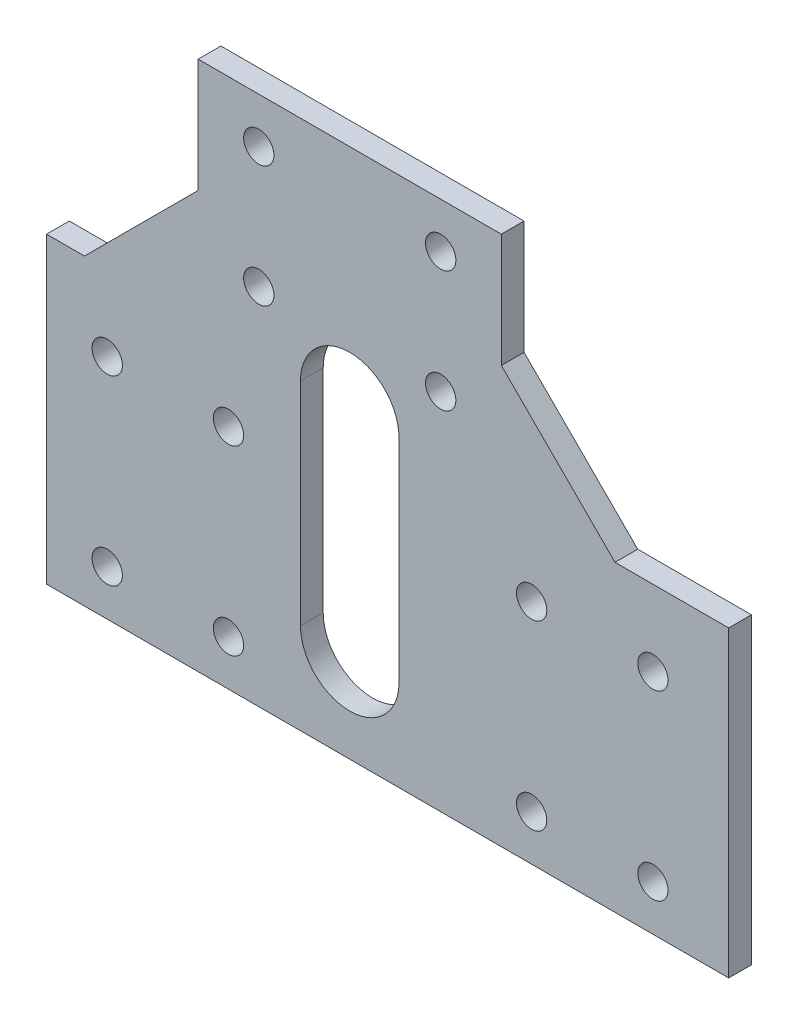
ISO-10303-21;
HEADER;
FILE_DESCRIPTION(('STEP AP214'),'2;1');
FILE_NAME('part.step','',(''),(''),'','','');
FILE_SCHEMA(('AUTOMOTIVE_DESIGN { 1 0 10303 214 1 1 1 1 }'));
ENDSEC;
DATA;
#1=APPLICATION_CONTEXT('core data for automotive mechanical design processes');
#2=APPLICATION_PROTOCOL_DEFINITION('international standard','automotive_design',2000,#1);
#3=PRODUCT_CONTEXT('',#1,'mechanical');
#4=PRODUCT('Part','Part','',(#3));
#5=PRODUCT_RELATED_PRODUCT_CATEGORY('part','',(#4));
#6=PRODUCT_DEFINITION_FORMATION('','',#4);
#7=PRODUCT_DEFINITION_CONTEXT('part definition',#1,'design');
#8=PRODUCT_DEFINITION('design','',#6,#7);
#9=PRODUCT_DEFINITION_SHAPE('','',#8);
#10=(LENGTH_UNIT() NAMED_UNIT(*) SI_UNIT(.MILLI.,.METRE.));
#11=(NAMED_UNIT(*) PLANE_ANGLE_UNIT() SI_UNIT($,.RADIAN.));
#12=(NAMED_UNIT(*) SI_UNIT($,.STERADIAN.) SOLID_ANGLE_UNIT());
#13=UNCERTAINTY_MEASURE_WITH_UNIT(LENGTH_MEASURE(1.E-05),#10,'distance_accuracy_value','');
#14=(GEOMETRIC_REPRESENTATION_CONTEXT(3) GLOBAL_UNCERTAINTY_ASSIGNED_CONTEXT((#13)) GLOBAL_UNIT_ASSIGNED_CONTEXT((#10,
#11,#12)) REPRESENTATION_CONTEXT('',''));
#15=CARTESIAN_POINT('',(0.,0.,0.));
#16=DIRECTION('',(0.,0.,1.));
#17=DIRECTION('',(1.,0.,0.));
#18=AXIS2_PLACEMENT_3D('',#15,#16,#17);
#19=CARTESIAN_POINT('',(0.,40.,3.));
#20=DIRECTION('',(0.,1.,0.));
#21=DIRECTION('',(0.,0.,1.));
#22=AXIS2_PLACEMENT_3D('',#19,#20,#21);
#23=PLANE('',#22);
#24=DIRECTION('',(1.,0.,0.));
#25=VECTOR('',#24,1.);
#26=CARTESIAN_POINT('',(0.,40.,0.));
#27=LINE('',#26,#25);
#28=CARTESIAN_POINT('',(74.9999999999998,40.,0.));
#29=VERTEX_POINT('',#28);
#30=CARTESIAN_POINT('',(90.,40.,0.));
#31=VERTEX_POINT('',#30);
#32=EDGE_CURVE('E238',#29,#31,#27,.T.);
#33=ORIENTED_EDGE('',*,*,#32,.F.);
#34=DIRECTION('',(0.,0.,-1.));
#35=VECTOR('',#34,1.);
#36=CARTESIAN_POINT('',(74.9999999999998,40.,3.));
#37=LINE('',#36,#35);
#38=CARTESIAN_POINT('',(74.9999999999998,40.,3.));
#39=VERTEX_POINT('',#38);
#40=EDGE_CURVE('E11',#39,#29,#37,.T.);
#41=ORIENTED_EDGE('',*,*,#40,.F.);
#42=DIRECTION('',(1.,0.,0.));
#43=VECTOR('',#42,1.);
#44=CARTESIAN_POINT('',(0.,40.,3.));
#45=LINE('',#44,#43);
#46=CARTESIAN_POINT('',(90.,40.,3.));
#47=VERTEX_POINT('',#46);
#48=EDGE_CURVE('E241',#39,#47,#45,.T.);
#49=ORIENTED_EDGE('',*,*,#48,.T.);
#50=DIRECTION('',(0.,0.,-1.));
#51=VECTOR('',#50,1.);
#52=CARTESIAN_POINT('',(90.,40.,3.));
#53=LINE('',#52,#51);
#54=EDGE_CURVE('E272',#47,#31,#53,.T.);
#55=ORIENTED_EDGE('',*,*,#54,.T.);
#56=EDGE_LOOP('',(#33,#41,#49,#55));
#57=FACE_BOUND('',#56,.T.);
#58=ADVANCED_FACE('F35',(#57),#23,.T.);
#59=CARTESIAN_POINT('',(57.5,57.4999999999998,3.));
#60=DIRECTION('',(0.707106781186549,0.707106781186546,0.));
#61=DIRECTION('',(-0.707106781186546,0.707106781186549,0.));
#62=AXIS2_PLACEMENT_3D('',#59,#60,#61);
#63=PLANE('',#62);
#64=DIRECTION('',(0.707106781186546,-0.707106781186549,0.));
#65=VECTOR('',#64,1.);
#66=CARTESIAN_POINT('',(57.5,57.4999999999998,0.));
#67=LINE('',#66,#65);
#68=CARTESIAN_POINT('',(60.,54.9999999999998,0.));
#69=VERTEX_POINT('',#68);
#70=EDGE_CURVE('E275',#69,#29,#67,.T.);
#71=ORIENTED_EDGE('',*,*,#70,.F.);
#72=DIRECTION('',(0.,0.,-1.));
#73=VECTOR('',#72,1.);
#74=CARTESIAN_POINT('',(60.,54.9999999999998,3.));
#75=LINE('',#74,#73);
#76=CARTESIAN_POINT('',(60.,54.9999999999998,3.));
#77=VERTEX_POINT('',#76);
#78=EDGE_CURVE('E42',#77,#69,#75,.T.);
#79=ORIENTED_EDGE('',*,*,#78,.F.);
#80=DIRECTION('',(0.707106781186546,-0.707106781186549,0.));
#81=VECTOR('',#80,1.);
#82=CARTESIAN_POINT('',(57.5,57.4999999999998,3.));
#83=LINE('',#82,#81);
#84=EDGE_CURVE('E244',#77,#39,#83,.T.);
#85=ORIENTED_EDGE('',*,*,#84,.T.);
#86=ORIENTED_EDGE('',*,*,#40,.T.);
#87=EDGE_LOOP('',(#71,#79,#85,#86));
#88=FACE_BOUND('',#87,.T.);
#89=ADVANCED_FACE('F322',(#88),#63,.T.);
#90=CARTESIAN_POINT('',(60.,0.,3.));
#91=DIRECTION('',(1.,0.,0.));
#92=DIRECTION('',(0.,1.,0.));
#93=AXIS2_PLACEMENT_3D('',#90,#91,#92);
#94=PLANE('',#93);
#95=DIRECTION('',(0.,-1.,0.));
#96=VECTOR('',#95,1.);
#97=CARTESIAN_POINT('',(60.,0.,0.));
#98=LINE('',#97,#96);
#99=CARTESIAN_POINT('',(60.,70.,0.));
#100=VERTEX_POINT('',#99);
#101=EDGE_CURVE('E278',#100,#69,#98,.T.);
#102=ORIENTED_EDGE('',*,*,#101,.F.);
#103=DIRECTION('',(0.,0.,-1.));
#104=VECTOR('',#103,1.);
#105=CARTESIAN_POINT('',(60.,70.,3.));
#106=LINE('',#105,#104);
#107=CARTESIAN_POINT('',(60.,70.,3.));
#108=VERTEX_POINT('',#107);
#109=EDGE_CURVE('E314',#108,#100,#106,.T.);
#110=ORIENTED_EDGE('',*,*,#109,.F.);
#111=DIRECTION('',(0.,-1.,0.));
#112=VECTOR('',#111,1.);
#113=CARTESIAN_POINT('',(60.,0.,3.));
#114=LINE('',#113,#112);
#115=EDGE_CURVE('E248',#108,#77,#114,.T.);
#116=ORIENTED_EDGE('',*,*,#115,.T.);
#117=ORIENTED_EDGE('',*,*,#78,.T.);
#118=EDGE_LOOP('',(#102,#110,#116,#117));
#119=FACE_BOUND('',#118,.T.);
#120=ADVANCED_FACE('F318',(#119),#94,.T.);
#121=CARTESIAN_POINT('',(0.,70.,3.));
#122=DIRECTION('',(0.,1.,0.));
#123=DIRECTION('',(-1.,0.,0.));
#124=AXIS2_PLACEMENT_3D('',#121,#122,#123);
#125=PLANE('',#124);
#126=DIRECTION('',(1.,0.,0.));
#127=VECTOR('',#126,1.);
#128=CARTESIAN_POINT('',(0.,70.,0.));
#129=LINE('',#128,#127);
#130=CARTESIAN_POINT('',(20.,70.,0.));
#131=VERTEX_POINT('',#130);
#132=EDGE_CURVE('E281',#131,#100,#129,.T.);
#133=ORIENTED_EDGE('',*,*,#132,.F.);
#134=DIRECTION('',(0.,0.,-1.));
#135=VECTOR('',#134,1.);
#136=CARTESIAN_POINT('',(20.,70.,3.));
#137=LINE('',#136,#135);
#138=CARTESIAN_POINT('',(20.,70.,3.));
#139=VERTEX_POINT('',#138);
#140=EDGE_CURVE('E312',#139,#131,#137,.T.);
#141=ORIENTED_EDGE('',*,*,#140,.F.);
#142=DIRECTION('',(1.,0.,0.));
#143=VECTOR('',#142,1.);
#144=CARTESIAN_POINT('',(0.,70.,3.));
#145=LINE('',#144,#143);
#146=EDGE_CURVE('E251',#139,#108,#145,.T.);
#147=ORIENTED_EDGE('',*,*,#146,.T.);
#148=ORIENTED_EDGE('',*,*,#109,.T.);
#149=EDGE_LOOP('',(#133,#141,#147,#148));
#150=FACE_BOUND('',#149,.T.);
#151=ADVANCED_FACE('F328',(#150),#125,.T.);
#152=CARTESIAN_POINT('',(20.,0.,3.));
#153=DIRECTION('',(-1.,0.,0.));
#154=DIRECTION('',(0.,0.,1.));
#155=AXIS2_PLACEMENT_3D('',#152,#153,#154);
#156=PLANE('',#155);
#157=DIRECTION('',(0.,1.,0.));
#158=VECTOR('',#157,1.);
#159=CARTESIAN_POINT('',(20.,0.,0.));
#160=LINE('',#159,#158);
#161=CARTESIAN_POINT('',(20.,54.9999999999998,0.));
#162=VERTEX_POINT('',#161);
#163=EDGE_CURVE('E284',#162,#131,#160,.T.);
#164=ORIENTED_EDGE('',*,*,#163,.F.);
#165=DIRECTION('',(0.,0.,-1.));
#166=VECTOR('',#165,1.);
#167=CARTESIAN_POINT('',(20.,54.9999999999998,3.));
#168=LINE('',#167,#166);
#169=CARTESIAN_POINT('',(20.,54.9999999999998,3.));
#170=VERTEX_POINT('',#169);
#171=EDGE_CURVE('E310',#170,#162,#168,.T.);
#172=ORIENTED_EDGE('',*,*,#171,.F.);
#173=DIRECTION('',(0.,1.,0.));
#174=VECTOR('',#173,1.);
#175=CARTESIAN_POINT('',(20.,0.,3.));
#176=LINE('',#175,#174);
#177=EDGE_CURVE('E254',#170,#139,#176,.T.);
#178=ORIENTED_EDGE('',*,*,#177,.T.);
#179=ORIENTED_EDGE('',*,*,#140,.T.);
#180=EDGE_LOOP('',(#164,#172,#178,#179));
#181=FACE_BOUND('',#180,.T.);
#182=ADVANCED_FACE('F356',(#181),#156,.T.);
#183=CARTESIAN_POINT('',(-17.5,17.5000000000002,3.));
#184=DIRECTION('',(-0.707106781186544,0.707106781186551,0.));
#185=DIRECTION('',(-0.707106781186551,-0.707106781186544,0.));
#186=AXIS2_PLACEMENT_3D('',#183,#184,#185);
#187=PLANE('',#186);
#188=DIRECTION('',(0.707106781186551,0.707106781186544,0.));
#189=VECTOR('',#188,1.);
#190=CARTESIAN_POINT('',(-17.5,17.5000000000002,0.));
#191=LINE('',#190,#189);
#192=CARTESIAN_POINT('',(5.,40.,0.));
#193=VERTEX_POINT('',#192);
#194=EDGE_CURVE('E287',#193,#162,#191,.T.);
#195=ORIENTED_EDGE('',*,*,#194,.F.);
#196=DIRECTION('',(0.,0.,-1.));
#197=VECTOR('',#196,1.);
#198=CARTESIAN_POINT('',(5.,40.,3.));
#199=LINE('',#198,#197);
#200=CARTESIAN_POINT('',(5.,40.,3.));
#201=VERTEX_POINT('',#200);
#202=EDGE_CURVE('E308',#201,#193,#199,.T.);
#203=ORIENTED_EDGE('',*,*,#202,.F.);
#204=DIRECTION('',(0.707106781186551,0.707106781186544,0.));
#205=VECTOR('',#204,1.);
#206=CARTESIAN_POINT('',(-17.5,17.5000000000002,3.));
#207=LINE('',#206,#205);
#208=EDGE_CURVE('E257',#201,#170,#207,.T.);
#209=ORIENTED_EDGE('',*,*,#208,.T.);
#210=ORIENTED_EDGE('',*,*,#171,.T.);
#211=EDGE_LOOP('',(#195,#203,#209,#210));
#212=FACE_BOUND('',#211,.T.);
#213=ADVANCED_FACE('F354',(#212),#187,.T.);
#214=CARTESIAN_POINT('',(0.,40.,3.));
#215=DIRECTION('',(0.,1.,0.));
#216=DIRECTION('',(0.,0.,1.));
#217=AXIS2_PLACEMENT_3D('',#214,#215,#216);
#218=PLANE('',#217);
#219=DIRECTION('',(1.,0.,0.));
#220=VECTOR('',#219,1.);
#221=CARTESIAN_POINT('',(0.,40.,0.));
#222=LINE('',#221,#220);
#223=CARTESIAN_POINT('',(0.,40.,0.));
#224=VERTEX_POINT('',#223);
#225=EDGE_CURVE('E290',#224,#193,#222,.T.);
#226=ORIENTED_EDGE('',*,*,#225,.F.);
#227=DIRECTION('',(0.,0.,-1.));
#228=VECTOR('',#227,1.);
#229=CARTESIAN_POINT('',(0.,40.,3.));
#230=LINE('',#229,#228);
#231=CARTESIAN_POINT('',(0.,40.,3.));
#232=VERTEX_POINT('',#231);
#233=EDGE_CURVE('E306',#232,#224,#230,.T.);
#234=ORIENTED_EDGE('',*,*,#233,.F.);
#235=DIRECTION('',(1.,0.,0.));
#236=VECTOR('',#235,1.);
#237=CARTESIAN_POINT('',(0.,40.,3.));
#238=LINE('',#237,#236);
#239=EDGE_CURVE('E260',#232,#201,#238,.T.);
#240=ORIENTED_EDGE('',*,*,#239,.T.);
#241=ORIENTED_EDGE('',*,*,#202,.T.);
#242=EDGE_LOOP('',(#226,#234,#240,#241));
#243=FACE_BOUND('',#242,.T.);
#244=ADVANCED_FACE('F350',(#243),#218,.T.);
#245=CARTESIAN_POINT('',(0.,0.,3.));
#246=DIRECTION('',(-1.,0.,0.));
#247=DIRECTION('',(0.,0.,1.));
#248=AXIS2_PLACEMENT_3D('',#245,#246,#247);
#249=PLANE('',#248);
#250=DIRECTION('',(0.,1.,0.));
#251=VECTOR('',#250,1.);
#252=CARTESIAN_POINT('',(0.,0.,0.));
#253=LINE('',#252,#251);
#254=CARTESIAN_POINT('',(0.,0.,0.));
#255=VERTEX_POINT('',#254);
#256=EDGE_CURVE('E293',#255,#224,#253,.T.);
#257=ORIENTED_EDGE('',*,*,#256,.F.);
#258=DIRECTION('',(0.,0.,-1.));
#259=VECTOR('',#258,1.);
#260=CARTESIAN_POINT('',(0.,0.,3.));
#261=LINE('',#260,#259);
#262=CARTESIAN_POINT('',(0.,0.,3.));
#263=VERTEX_POINT('',#262);
#264=EDGE_CURVE('E304',#263,#255,#261,.T.);
#265=ORIENTED_EDGE('',*,*,#264,.F.);
#266=DIRECTION('',(0.,1.,0.));
#267=VECTOR('',#266,1.);
#268=CARTESIAN_POINT('',(0.,0.,3.));
#269=LINE('',#268,#267);
#270=EDGE_CURVE('E263',#263,#232,#269,.T.);
#271=ORIENTED_EDGE('',*,*,#270,.T.);
#272=ORIENTED_EDGE('',*,*,#233,.T.);
#273=EDGE_LOOP('',(#257,#265,#271,#272));
#274=FACE_BOUND('',#273,.T.);
#275=ADVANCED_FACE('F346',(#274),#249,.T.);
#276=CARTESIAN_POINT('',(0.,0.,3.));
#277=DIRECTION('',(0.,-1.,0.));
#278=DIRECTION('',(1.,0.,0.));
#279=AXIS2_PLACEMENT_3D('',#276,#277,#278);
#280=PLANE('',#279);
#281=DIRECTION('',(-1.,0.,0.));
#282=VECTOR('',#281,1.);
#283=CARTESIAN_POINT('',(0.,0.,0.));
#284=LINE('',#283,#282);
#285=CARTESIAN_POINT('',(90.,0.,0.));
#286=VERTEX_POINT('',#285);
#287=EDGE_CURVE('E296',#286,#255,#284,.T.);
#288=ORIENTED_EDGE('',*,*,#287,.F.);
#289=DIRECTION('',(0.,0.,-1.));
#290=VECTOR('',#289,1.);
#291=CARTESIAN_POINT('',(90.,0.,3.));
#292=LINE('',#291,#290);
#293=CARTESIAN_POINT('',(90.,0.,3.));
#294=VERTEX_POINT('',#293);
#295=EDGE_CURVE('E302',#294,#286,#292,.T.);
#296=ORIENTED_EDGE('',*,*,#295,.F.);
#297=DIRECTION('',(-1.,0.,0.));
#298=VECTOR('',#297,1.);
#299=CARTESIAN_POINT('',(0.,0.,3.));
#300=LINE('',#299,#298);
#301=EDGE_CURVE('E266',#294,#263,#300,.T.);
#302=ORIENTED_EDGE('',*,*,#301,.T.);
#303=ORIENTED_EDGE('',*,*,#264,.T.);
#304=EDGE_LOOP('',(#288,#296,#302,#303));
#305=FACE_BOUND('',#304,.T.);
#306=ADVANCED_FACE('F342',(#305),#280,.T.);
#307=CARTESIAN_POINT('',(90.,0.,3.));
#308=DIRECTION('',(1.,0.,0.));
#309=DIRECTION('',(0.,0.,-1.));
#310=AXIS2_PLACEMENT_3D('',#307,#308,#309);
#311=PLANE('',#310);
#312=DIRECTION('',(0.,-1.,0.));
#313=VECTOR('',#312,1.);
#314=CARTESIAN_POINT('',(90.,0.,0.));
#315=LINE('',#314,#313);
#316=EDGE_CURVE('E245',#31,#286,#315,.T.);
#317=ORIENTED_EDGE('',*,*,#316,.F.);
#318=ORIENTED_EDGE('',*,*,#54,.F.);
#319=DIRECTION('',(0.,-1.,0.));
#320=VECTOR('',#319,1.);
#321=CARTESIAN_POINT('',(90.,0.,3.));
#322=LINE('',#321,#320);
#323=EDGE_CURVE('E269',#47,#294,#322,.T.);
#324=ORIENTED_EDGE('',*,*,#323,.T.);
#325=ORIENTED_EDGE('',*,*,#295,.T.);
#326=EDGE_LOOP('',(#317,#318,#324,#325));
#327=FACE_BOUND('',#326,.T.);
#328=ADVANCED_FACE('F339',(#327),#311,.T.);
#329=CARTESIAN_POINT('',(0.,0.,3.));
#330=DIRECTION('',(0.,0.,1.));
#331=DIRECTION('',(1.,0.,0.));
#332=AXIS2_PLACEMENT_3D('',#329,#330,#331);
#333=PLANE('',#332);
#334=CARTESIAN_POINT('',(24.,30.,3.));
#335=DIRECTION('',(0.,0.,1.));
#336=DIRECTION('',(1.,0.,0.));
#337=AXIS2_PLACEMENT_3D('',#334,#335,#336);
#338=CIRCLE('',#337,2.00000000000001);
#339=CARTESIAN_POINT('',(26.,30.,3.));
#340=VERTEX_POINT('',#339);
#341=EDGE_CURVE('E203',#340,#340,#338,.T.);
#342=ORIENTED_EDGE('',*,*,#341,.F.);
#343=EDGE_LOOP('',(#342));
#344=FACE_BOUND('',#343,.T.);
#345=CARTESIAN_POINT('',(80.,30.,3.));
#346=DIRECTION('',(0.,0.,1.));
#347=DIRECTION('',(1.,0.,0.));
#348=AXIS2_PLACEMENT_3D('',#345,#346,#347);
#349=CIRCLE('',#348,2.);
#350=CARTESIAN_POINT('',(82.,30.,3.));
#351=VERTEX_POINT('',#350);
#352=EDGE_CURVE('E190',#351,#351,#349,.T.);
#353=ORIENTED_EDGE('',*,*,#352,.F.);
#354=EDGE_LOOP('',(#353));
#355=FACE_BOUND('',#354,.T.);
#356=CARTESIAN_POINT('',(64.,30.,3.));
#357=DIRECTION('',(0.,0.,1.));
#358=DIRECTION('',(1.,0.,0.));
#359=AXIS2_PLACEMENT_3D('',#356,#357,#358);
#360=CIRCLE('',#359,2.);
#361=CARTESIAN_POINT('',(66.,30.,3.));
#362=VERTEX_POINT('',#361);
#363=EDGE_CURVE('E191',#362,#362,#360,.T.);
#364=ORIENTED_EDGE('',*,*,#363,.F.);
#365=EDGE_LOOP('',(#364));
#366=FACE_BOUND('',#365,.T.);
#367=CARTESIAN_POINT('',(80.,6.,3.));
#368=DIRECTION('',(0.,0.,1.));
#369=DIRECTION('',(1.,0.,0.));
#370=AXIS2_PLACEMENT_3D('',#367,#368,#369);
#371=CIRCLE('',#370,2.);
#372=CARTESIAN_POINT('',(82.,6.,3.));
#373=VERTEX_POINT('',#372);
#374=EDGE_CURVE('E176',#373,#373,#371,.T.);
#375=ORIENTED_EDGE('',*,*,#374,.F.);
#376=EDGE_LOOP('',(#375));
#377=FACE_BOUND('',#376,.T.);
#378=CARTESIAN_POINT('',(52.,64.,3.));
#379=DIRECTION('',(0.,0.,1.));
#380=DIRECTION('',(1.,0.,0.));
#381=AXIS2_PLACEMENT_3D('',#378,#379,#380);
#382=CIRCLE('',#381,2.);
#383=CARTESIAN_POINT('',(54.,64.,3.));
#384=VERTEX_POINT('',#383);
#385=EDGE_CURVE('E227',#384,#384,#382,.T.);
#386=ORIENTED_EDGE('',*,*,#385,.F.);
#387=EDGE_LOOP('',(#386));
#388=FACE_BOUND('',#387,.T.);
#389=CARTESIAN_POINT('',(28.,48.,3.));
#390=DIRECTION('',(0.,0.,1.));
#391=DIRECTION('',(1.,0.,0.));
#392=AXIS2_PLACEMENT_3D('',#389,#390,#391);
#393=CIRCLE('',#392,2.00000000000001);
#394=CARTESIAN_POINT('',(30.,48.,3.));
#395=VERTEX_POINT('',#394);
#396=EDGE_CURVE('E214',#395,#395,#393,.T.);
#397=ORIENTED_EDGE('',*,*,#396,.F.);
#398=EDGE_LOOP('',(#397));
#399=FACE_BOUND('',#398,.T.);
#400=CARTESIAN_POINT('',(52.,48.,3.));
#401=DIRECTION('',(0.,0.,1.));
#402=DIRECTION('',(1.,0.,0.));
#403=AXIS2_PLACEMENT_3D('',#400,#401,#402);
#404=CIRCLE('',#403,2.00000000000002);
#405=CARTESIAN_POINT('',(54.,48.,3.));
#406=VERTEX_POINT('',#405);
#407=EDGE_CURVE('E215',#406,#406,#404,.T.);
#408=ORIENTED_EDGE('',*,*,#407,.F.);
#409=EDGE_LOOP('',(#408));
#410=FACE_BOUND('',#409,.T.);
#411=CARTESIAN_POINT('',(8.,30.,3.));
#412=DIRECTION('',(0.,0.,1.));
#413=DIRECTION('',(1.,0.,0.));
#414=AXIS2_PLACEMENT_3D('',#411,#412,#413);
#415=CIRCLE('',#414,2.);
#416=CARTESIAN_POINT('',(10.,30.,3.));
#417=VERTEX_POINT('',#416);
#418=EDGE_CURVE('E202',#417,#417,#415,.T.);
#419=ORIENTED_EDGE('',*,*,#418,.F.);
#420=EDGE_LOOP('',(#419));
#421=FACE_BOUND('',#420,.T.);
#422=CARTESIAN_POINT('',(40.,40.,3.));
#423=DIRECTION('',(0.,0.,1.));
#424=DIRECTION('',(1.,0.,0.));
#425=AXIS2_PLACEMENT_3D('',#422,#423,#424);
#426=CIRCLE('',#425,6.50000000000001);
#427=CARTESIAN_POINT('',(46.5,40.,3.));
#428=VERTEX_POINT('',#427);
#429=CARTESIAN_POINT('',(33.5,40.,3.));
#430=VERTEX_POINT('',#429);
#431=EDGE_CURVE('E49',#428,#430,#426,.T.);
#432=ORIENTED_EDGE('',*,*,#431,.F.);
#433=DIRECTION('',(0.,1.,0.));
#434=VECTOR('',#433,1.);
#435=CARTESIAN_POINT('',(46.5,40.,3.));
#436=LINE('',#435,#434);
#437=CARTESIAN_POINT('',(46.5,12.,3.));
#438=VERTEX_POINT('',#437);
#439=EDGE_CURVE('E152',#438,#428,#436,.T.);
#440=ORIENTED_EDGE('',*,*,#439,.F.);
#441=CARTESIAN_POINT('',(40.,12.,3.));
#442=DIRECTION('',(0.,0.,1.));
#443=DIRECTION('',(1.,0.,0.));
#444=AXIS2_PLACEMENT_3D('',#441,#442,#443);
#445=CIRCLE('',#444,6.50000000000001);
#446=CARTESIAN_POINT('',(33.5,12.,3.));
#447=VERTEX_POINT('',#446);
#448=EDGE_CURVE('E155',#447,#438,#445,.T.);
#449=ORIENTED_EDGE('',*,*,#448,.F.);
#450=DIRECTION('',(0.,-1.,0.));
#451=VECTOR('',#450,1.);
#452=CARTESIAN_POINT('',(33.5,40.,3.));
#453=LINE('',#452,#451);
#454=EDGE_CURVE('E164',#430,#447,#453,.T.);
#455=ORIENTED_EDGE('',*,*,#454,.F.);
#456=EDGE_LOOP('',(#432,#440,#449,#455));
#457=FACE_BOUND('',#456,.T.);
#458=CARTESIAN_POINT('',(8.,5.99999999999999,3.));
#459=DIRECTION('',(0.,0.,1.));
#460=DIRECTION('',(1.,0.,0.));
#461=AXIS2_PLACEMENT_3D('',#458,#459,#460);
#462=CIRCLE('',#461,2.);
#463=CARTESIAN_POINT('',(10.,5.99999999999999,3.));
#464=VERTEX_POINT('',#463);
#465=EDGE_CURVE('E158',#464,#464,#462,.T.);
#466=ORIENTED_EDGE('',*,*,#465,.F.);
#467=EDGE_LOOP('',(#466));
#468=FACE_BOUND('',#467,.T.);
#469=CARTESIAN_POINT('',(24.,5.99999999999999,3.));
#470=DIRECTION('',(0.,0.,1.));
#471=DIRECTION('',(1.,0.,0.));
#472=AXIS2_PLACEMENT_3D('',#469,#470,#471);
#473=CIRCLE('',#472,2.);
#474=CARTESIAN_POINT('',(26.,5.99999999999999,3.));
#475=VERTEX_POINT('',#474);
#476=EDGE_CURVE('E183',#475,#475,#473,.T.);
#477=ORIENTED_EDGE('',*,*,#476,.F.);
#478=EDGE_LOOP('',(#477));
#479=FACE_BOUND('',#478,.T.);
#480=CARTESIAN_POINT('',(64.,6.,3.));
#481=DIRECTION('',(0.,0.,1.));
#482=DIRECTION('',(1.,0.,0.));
#483=AXIS2_PLACEMENT_3D('',#480,#481,#482);
#484=CIRCLE('',#483,2.);
#485=CARTESIAN_POINT('',(66.,6.,3.));
#486=VERTEX_POINT('',#485);
#487=EDGE_CURVE('E177',#486,#486,#484,.T.);
#488=ORIENTED_EDGE('',*,*,#487,.F.);
#489=EDGE_LOOP('',(#488));
#490=FACE_BOUND('',#489,.T.);
#491=CARTESIAN_POINT('',(28.,64.,3.));
#492=DIRECTION('',(0.,0.,1.));
#493=DIRECTION('',(1.,0.,0.));
#494=AXIS2_PLACEMENT_3D('',#491,#492,#493);
#495=CIRCLE('',#494,2.);
#496=CARTESIAN_POINT('',(30.,64.,3.));
#497=VERTEX_POINT('',#496);
#498=EDGE_CURVE('E226',#497,#497,#495,.T.);
#499=ORIENTED_EDGE('',*,*,#498,.F.);
#500=EDGE_LOOP('',(#499));
#501=FACE_BOUND('',#500,.T.);
#502=ORIENTED_EDGE('',*,*,#48,.F.);
#503=ORIENTED_EDGE('',*,*,#84,.F.);
#504=ORIENTED_EDGE('',*,*,#115,.F.);
#505=ORIENTED_EDGE('',*,*,#146,.F.);
#506=ORIENTED_EDGE('',*,*,#177,.F.);
#507=ORIENTED_EDGE('',*,*,#208,.F.);
#508=ORIENTED_EDGE('',*,*,#239,.F.);
#509=ORIENTED_EDGE('',*,*,#270,.F.);
#510=ORIENTED_EDGE('',*,*,#301,.F.);
#511=ORIENTED_EDGE('',*,*,#323,.F.);
#512=EDGE_LOOP('',(#502,#503,#504,#505,#506,#507,#508,#509,#510,#511));
#513=FACE_BOUND('',#512,.T.);
#514=ADVANCED_FACE('F332',(#344,#355,#366,#377,#388,#399,#410,#421,#457,#468,#479,#490,#501,
#513),#333,.T.);
#515=CARTESIAN_POINT('',(0.,0.,0.));
#516=DIRECTION('',(0.,0.,1.));
#517=DIRECTION('',(1.,0.,0.));
#518=AXIS2_PLACEMENT_3D('',#515,#516,#517);
#519=PLANE('',#518);
#520=CARTESIAN_POINT('',(24.,30.,0.));
#521=DIRECTION('',(0.,0.,1.));
#522=DIRECTION('',(1.,0.,0.));
#523=AXIS2_PLACEMENT_3D('',#520,#521,#522);
#524=CIRCLE('',#523,2.00000000000001);
#525=CARTESIAN_POINT('',(26.,30.,0.));
#526=VERTEX_POINT('',#525);
#527=EDGE_CURVE('E199',#526,#526,#524,.T.);
#528=ORIENTED_EDGE('',*,*,#527,.T.);
#529=EDGE_LOOP('',(#528));
#530=FACE_BOUND('',#529,.T.);
#531=CARTESIAN_POINT('',(80.,30.,0.));
#532=DIRECTION('',(0.,0.,1.));
#533=DIRECTION('',(1.,0.,0.));
#534=AXIS2_PLACEMENT_3D('',#531,#532,#533);
#535=CIRCLE('',#534,2.);
#536=CARTESIAN_POINT('',(82.,30.,0.));
#537=VERTEX_POINT('',#536);
#538=EDGE_CURVE('E206',#537,#537,#535,.T.);
#539=ORIENTED_EDGE('',*,*,#538,.T.);
#540=EDGE_LOOP('',(#539));
#541=FACE_BOUND('',#540,.T.);
#542=CARTESIAN_POINT('',(64.,30.,0.));
#543=DIRECTION('',(0.,0.,1.));
#544=DIRECTION('',(1.,0.,0.));
#545=AXIS2_PLACEMENT_3D('',#542,#543,#544);
#546=CIRCLE('',#545,2.);
#547=CARTESIAN_POINT('',(66.,30.,0.));
#548=VERTEX_POINT('',#547);
#549=EDGE_CURVE('E187',#548,#548,#546,.T.);
#550=ORIENTED_EDGE('',*,*,#549,.T.);
#551=EDGE_LOOP('',(#550));
#552=FACE_BOUND('',#551,.T.);
#553=CARTESIAN_POINT('',(80.,6.,0.));
#554=DIRECTION('',(0.,0.,1.));
#555=DIRECTION('',(1.,0.,0.));
#556=AXIS2_PLACEMENT_3D('',#553,#554,#555);
#557=CIRCLE('',#556,2.);
#558=CARTESIAN_POINT('',(82.,6.,0.));
#559=VERTEX_POINT('',#558);
#560=EDGE_CURVE('E194',#559,#559,#557,.T.);
#561=ORIENTED_EDGE('',*,*,#560,.T.);
#562=EDGE_LOOP('',(#561));
#563=FACE_BOUND('',#562,.T.);
#564=CARTESIAN_POINT('',(52.,64.,0.));
#565=DIRECTION('',(0.,0.,1.));
#566=DIRECTION('',(1.,0.,0.));
#567=AXIS2_PLACEMENT_3D('',#564,#565,#566);
#568=CIRCLE('',#567,2.);
#569=CARTESIAN_POINT('',(54.,64.,0.));
#570=VERTEX_POINT('',#569);
#571=EDGE_CURVE('E223',#570,#570,#568,.T.);
#572=ORIENTED_EDGE('',*,*,#571,.T.);
#573=EDGE_LOOP('',(#572));
#574=FACE_BOUND('',#573,.T.);
#575=CARTESIAN_POINT('',(28.,48.,0.));
#576=DIRECTION('',(0.,0.,1.));
#577=DIRECTION('',(1.,0.,0.));
#578=AXIS2_PLACEMENT_3D('',#575,#576,#577);
#579=CIRCLE('',#578,2.00000000000001);
#580=CARTESIAN_POINT('',(30.,48.,0.));
#581=VERTEX_POINT('',#580);
#582=EDGE_CURVE('E230',#581,#581,#579,.T.);
#583=ORIENTED_EDGE('',*,*,#582,.T.);
#584=EDGE_LOOP('',(#583));
#585=FACE_BOUND('',#584,.T.);
#586=CARTESIAN_POINT('',(52.,48.,0.));
#587=DIRECTION('',(0.,0.,1.));
#588=DIRECTION('',(1.,0.,0.));
#589=AXIS2_PLACEMENT_3D('',#586,#587,#588);
#590=CIRCLE('',#589,2.00000000000002);
#591=CARTESIAN_POINT('',(54.,48.,0.));
#592=VERTEX_POINT('',#591);
#593=EDGE_CURVE('E211',#592,#592,#590,.T.);
#594=ORIENTED_EDGE('',*,*,#593,.T.);
#595=EDGE_LOOP('',(#594));
#596=FACE_BOUND('',#595,.T.);
#597=CARTESIAN_POINT('',(8.,30.,0.));
#598=DIRECTION('',(0.,0.,1.));
#599=DIRECTION('',(1.,0.,0.));
#600=AXIS2_PLACEMENT_3D('',#597,#598,#599);
#601=CIRCLE('',#600,2.);
#602=CARTESIAN_POINT('',(10.,30.,0.));
#603=VERTEX_POINT('',#602);
#604=EDGE_CURVE('E218',#603,#603,#601,.T.);
#605=ORIENTED_EDGE('',*,*,#604,.T.);
#606=EDGE_LOOP('',(#605));
#607=FACE_BOUND('',#606,.T.);
#608=DIRECTION('',(0.,1.,0.));
#609=VECTOR('',#608,1.);
#610=CARTESIAN_POINT('',(46.5,40.,0.));
#611=LINE('',#610,#609);
#612=CARTESIAN_POINT('',(46.5,12.,0.));
#613=VERTEX_POINT('',#612);
#614=CARTESIAN_POINT('',(46.5,40.,0.));
#615=VERTEX_POINT('',#614);
#616=EDGE_CURVE('E142',#613,#615,#611,.T.);
#617=ORIENTED_EDGE('',*,*,#616,.T.);
#618=CARTESIAN_POINT('',(40.,40.,0.));
#619=DIRECTION('',(0.,0.,1.));
#620=DIRECTION('',(1.,0.,0.));
#621=AXIS2_PLACEMENT_3D('',#618,#619,#620);
#622=CIRCLE('',#621,6.50000000000001);
#623=CARTESIAN_POINT('',(33.5,40.,0.));
#624=VERTEX_POINT('',#623);
#625=EDGE_CURVE('E136',#615,#624,#622,.T.);
#626=ORIENTED_EDGE('',*,*,#625,.T.);
#627=DIRECTION('',(0.,-1.,0.));
#628=VECTOR('',#627,1.);
#629=CARTESIAN_POINT('',(33.5,40.,0.));
#630=LINE('',#629,#628);
#631=CARTESIAN_POINT('',(33.5,12.,0.));
#632=VERTEX_POINT('',#631);
#633=EDGE_CURVE('E145',#624,#632,#630,.T.);
#634=ORIENTED_EDGE('',*,*,#633,.T.);
#635=CARTESIAN_POINT('',(40.,12.,0.));
#636=DIRECTION('',(0.,0.,1.));
#637=DIRECTION('',(1.,0.,0.));
#638=AXIS2_PLACEMENT_3D('',#635,#636,#637);
#639=CIRCLE('',#638,6.50000000000001);
#640=EDGE_CURVE('E57',#632,#613,#639,.T.);
#641=ORIENTED_EDGE('',*,*,#640,.T.);
#642=EDGE_LOOP('',(#617,#626,#634,#641));
#643=FACE_BOUND('',#642,.T.);
#644=CARTESIAN_POINT('',(8.,5.99999999999999,0.));
#645=DIRECTION('',(0.,0.,1.));
#646=DIRECTION('',(1.,0.,0.));
#647=AXIS2_PLACEMENT_3D('',#644,#645,#646);
#648=CIRCLE('',#647,2.);
#649=CARTESIAN_POINT('',(10.,5.99999999999999,0.));
#650=VERTEX_POINT('',#649);
#651=EDGE_CURVE('E186',#650,#650,#648,.T.);
#652=ORIENTED_EDGE('',*,*,#651,.T.);
#653=EDGE_LOOP('',(#652));
#654=FACE_BOUND('',#653,.T.);
#655=CARTESIAN_POINT('',(24.,5.99999999999999,0.));
#656=DIRECTION('',(0.,0.,1.));
#657=DIRECTION('',(1.,0.,0.));
#658=AXIS2_PLACEMENT_3D('',#655,#656,#657);
#659=CIRCLE('',#658,2.);
#660=CARTESIAN_POINT('',(26.,5.99999999999999,0.));
#661=VERTEX_POINT('',#660);
#662=EDGE_CURVE('E180',#661,#661,#659,.T.);
#663=ORIENTED_EDGE('',*,*,#662,.T.);
#664=EDGE_LOOP('',(#663));
#665=FACE_BOUND('',#664,.T.);
#666=CARTESIAN_POINT('',(64.,6.,0.));
#667=DIRECTION('',(0.,0.,1.));
#668=DIRECTION('',(1.,0.,0.));
#669=AXIS2_PLACEMENT_3D('',#666,#667,#668);
#670=CIRCLE('',#669,2.);
#671=CARTESIAN_POINT('',(66.,6.,0.));
#672=VERTEX_POINT('',#671);
#673=EDGE_CURVE('E173',#672,#672,#670,.T.);
#674=ORIENTED_EDGE('',*,*,#673,.T.);
#675=EDGE_LOOP('',(#674));
#676=FACE_BOUND('',#675,.T.);
#677=CARTESIAN_POINT('',(28.,64.,0.));
#678=DIRECTION('',(0.,0.,1.));
#679=DIRECTION('',(1.,0.,0.));
#680=AXIS2_PLACEMENT_3D('',#677,#678,#679);
#681=CIRCLE('',#680,2.);
#682=CARTESIAN_POINT('',(30.,64.,0.));
#683=VERTEX_POINT('',#682);
#684=EDGE_CURVE('E235',#683,#683,#681,.T.);
#685=ORIENTED_EDGE('',*,*,#684,.T.);
#686=EDGE_LOOP('',(#685));
#687=FACE_BOUND('',#686,.T.);
#688=ORIENTED_EDGE('',*,*,#32,.T.);
#689=ORIENTED_EDGE('',*,*,#316,.T.);
#690=ORIENTED_EDGE('',*,*,#287,.T.);
#691=ORIENTED_EDGE('',*,*,#256,.T.);
#692=ORIENTED_EDGE('',*,*,#225,.T.);
#693=ORIENTED_EDGE('',*,*,#194,.T.);
#694=ORIENTED_EDGE('',*,*,#163,.T.);
#695=ORIENTED_EDGE('',*,*,#132,.T.);
#696=ORIENTED_EDGE('',*,*,#101,.T.);
#697=ORIENTED_EDGE('',*,*,#70,.T.);
#698=EDGE_LOOP('',(#688,#689,#690,#691,#692,#693,#694,#695,#696,#697));
#699=FACE_BOUND('',#698,.T.);
#700=ADVANCED_FACE('F149',(#530,#541,#552,#563,#574,#585,#596,#607,#643,#654,#665,#676,#687,
#699),#519,.F.);
#701=CARTESIAN_POINT('',(28.,64.,0.));
#702=DIRECTION('',(0.,0.,1.));
#703=DIRECTION('',(1.,0.,0.));
#704=AXIS2_PLACEMENT_3D('',#701,#702,#703);
#705=CYLINDRICAL_SURFACE('',#704,2.);
#706=ORIENTED_EDGE('',*,*,#684,.F.);
#707=EDGE_LOOP('',(#706));
#708=FACE_BOUND('',#707,.T.);
#709=ORIENTED_EDGE('',*,*,#498,.T.);
#710=EDGE_LOOP('',(#709));
#711=FACE_BOUND('',#710,.T.);
#712=ADVANCED_FACE('F439',(#708,#711),#705,.F.);
#713=CARTESIAN_POINT('',(64.,6.,0.));
#714=DIRECTION('',(0.,0.,1.));
#715=DIRECTION('',(1.,0.,0.));
#716=AXIS2_PLACEMENT_3D('',#713,#714,#715);
#717=CYLINDRICAL_SURFACE('',#716,2.);
#718=ORIENTED_EDGE('',*,*,#673,.F.);
#719=EDGE_LOOP('',(#718));
#720=FACE_BOUND('',#719,.T.);
#721=ORIENTED_EDGE('',*,*,#487,.T.);
#722=EDGE_LOOP('',(#721));
#723=FACE_BOUND('',#722,.T.);
#724=ADVANCED_FACE('F449',(#720,#723),#717,.F.);
#725=CARTESIAN_POINT('',(24.,5.99999999999999,0.));
#726=DIRECTION('',(0.,0.,1.));
#727=DIRECTION('',(1.,0.,0.));
#728=AXIS2_PLACEMENT_3D('',#725,#726,#727);
#729=CYLINDRICAL_SURFACE('',#728,2.);
#730=ORIENTED_EDGE('',*,*,#662,.F.);
#731=EDGE_LOOP('',(#730));
#732=FACE_BOUND('',#731,.T.);
#733=ORIENTED_EDGE('',*,*,#476,.T.);
#734=EDGE_LOOP('',(#733));
#735=FACE_BOUND('',#734,.T.);
#736=ADVANCED_FACE('F459',(#732,#735),#729,.F.);
#737=CARTESIAN_POINT('',(8.,5.99999999999999,0.));
#738=DIRECTION('',(0.,0.,1.));
#739=DIRECTION('',(1.,0.,0.));
#740=AXIS2_PLACEMENT_3D('',#737,#738,#739);
#741=CYLINDRICAL_SURFACE('',#740,2.);
#742=ORIENTED_EDGE('',*,*,#651,.F.);
#743=EDGE_LOOP('',(#742));
#744=FACE_BOUND('',#743,.T.);
#745=ORIENTED_EDGE('',*,*,#465,.T.);
#746=EDGE_LOOP('',(#745));
#747=FACE_BOUND('',#746,.T.);
#748=ADVANCED_FACE('F469',(#744,#747),#741,.F.);
#749=CARTESIAN_POINT('',(40.,40.,0.));
#750=DIRECTION('',(0.,0.,1.));
#751=DIRECTION('',(1.,0.,0.));
#752=AXIS2_PLACEMENT_3D('',#749,#750,#751);
#753=CYLINDRICAL_SURFACE('',#752,6.50000000000001);
#754=ORIENTED_EDGE('',*,*,#431,.T.);
#755=DIRECTION('',(0.,0.,1.));
#756=VECTOR('',#755,1.);
#757=CARTESIAN_POINT('',(33.5,40.,0.));
#758=LINE('',#757,#756);
#759=EDGE_CURVE('E132',#624,#430,#758,.T.);
#760=ORIENTED_EDGE('',*,*,#759,.F.);
#761=ORIENTED_EDGE('',*,*,#625,.F.);
#762=DIRECTION('',(0.,0.,1.));
#763=VECTOR('',#762,1.);
#764=CARTESIAN_POINT('',(46.5,40.,0.));
#765=LINE('',#764,#763);
#766=EDGE_CURVE('E168',#615,#428,#765,.T.);
#767=ORIENTED_EDGE('',*,*,#766,.T.);
#768=EDGE_LOOP('',(#754,#760,#761,#767));
#769=FACE_BOUND('',#768,.T.);
#770=ADVANCED_FACE('F134',(#769),#753,.F.);
#771=CARTESIAN_POINT('',(46.5,40.,0.));
#772=DIRECTION('',(1.,0.,0.));
#773=DIRECTION('',(0.,0.,-1.));
#774=AXIS2_PLACEMENT_3D('',#771,#772,#773);
#775=PLANE('',#774);
#776=ORIENTED_EDGE('',*,*,#439,.T.);
#777=ORIENTED_EDGE('',*,*,#766,.F.);
#778=ORIENTED_EDGE('',*,*,#616,.F.);
#779=DIRECTION('',(0.,0.,1.));
#780=VECTOR('',#779,1.);
#781=CARTESIAN_POINT('',(46.5,12.,0.));
#782=LINE('',#781,#780);
#783=EDGE_CURVE('E170',#613,#438,#782,.T.);
#784=ORIENTED_EDGE('',*,*,#783,.T.);
#785=EDGE_LOOP('',(#776,#777,#778,#784));
#786=FACE_BOUND('',#785,.T.);
#787=ADVANCED_FACE('F488',(#786),#775,.F.);
#788=CARTESIAN_POINT('',(40.,12.,0.));
#789=DIRECTION('',(0.,0.,1.));
#790=DIRECTION('',(1.,0.,0.));
#791=AXIS2_PLACEMENT_3D('',#788,#789,#790);
#792=CYLINDRICAL_SURFACE('',#791,6.50000000000001);
#793=ORIENTED_EDGE('',*,*,#448,.T.);
#794=ORIENTED_EDGE('',*,*,#783,.F.);
#795=ORIENTED_EDGE('',*,*,#640,.F.);
#796=DIRECTION('',(0.,0.,1.));
#797=VECTOR('',#796,1.);
#798=CARTESIAN_POINT('',(33.5,12.,0.));
#799=LINE('',#798,#797);
#800=EDGE_CURVE('E141',#632,#447,#799,.T.);
#801=ORIENTED_EDGE('',*,*,#800,.T.);
#802=EDGE_LOOP('',(#793,#794,#795,#801));
#803=FACE_BOUND('',#802,.T.);
#804=ADVANCED_FACE('F497',(#803),#792,.F.);
#805=CARTESIAN_POINT('',(33.5,40.,0.));
#806=DIRECTION('',(-1.,0.,0.));
#807=DIRECTION('',(0.,-1.,0.));
#808=AXIS2_PLACEMENT_3D('',#805,#806,#807);
#809=PLANE('',#808);
#810=ORIENTED_EDGE('',*,*,#454,.T.);
#811=ORIENTED_EDGE('',*,*,#800,.F.);
#812=ORIENTED_EDGE('',*,*,#633,.F.);
#813=ORIENTED_EDGE('',*,*,#759,.T.);
#814=EDGE_LOOP('',(#810,#811,#812,#813));
#815=FACE_BOUND('',#814,.T.);
#816=ADVANCED_FACE('F146',(#815),#809,.F.);
#817=CARTESIAN_POINT('',(8.,30.,0.));
#818=DIRECTION('',(0.,0.,1.));
#819=DIRECTION('',(1.,0.,0.));
#820=AXIS2_PLACEMENT_3D('',#817,#818,#819);
#821=CYLINDRICAL_SURFACE('',#820,2.);
#822=ORIENTED_EDGE('',*,*,#604,.F.);
#823=EDGE_LOOP('',(#822));
#824=FACE_BOUND('',#823,.T.);
#825=ORIENTED_EDGE('',*,*,#418,.T.);
#826=EDGE_LOOP('',(#825));
#827=FACE_BOUND('',#826,.T.);
#828=ADVANCED_FACE('F515',(#824,#827),#821,.F.);
#829=CARTESIAN_POINT('',(52.,48.,0.));
#830=DIRECTION('',(0.,0.,1.));
#831=DIRECTION('',(1.,0.,0.));
#832=AXIS2_PLACEMENT_3D('',#829,#830,#831);
#833=CYLINDRICAL_SURFACE('',#832,2.00000000000002);
#834=ORIENTED_EDGE('',*,*,#593,.F.);
#835=EDGE_LOOP('',(#834));
#836=FACE_BOUND('',#835,.T.);
#837=ORIENTED_EDGE('',*,*,#407,.T.);
#838=EDGE_LOOP('',(#837));
#839=FACE_BOUND('',#838,.T.);
#840=ADVANCED_FACE('F524',(#836,#839),#833,.F.);
#841=CARTESIAN_POINT('',(28.,48.,0.));
#842=DIRECTION('',(0.,0.,1.));
#843=DIRECTION('',(1.,0.,0.));
#844=AXIS2_PLACEMENT_3D('',#841,#842,#843);
#845=CYLINDRICAL_SURFACE('',#844,2.00000000000001);
#846=ORIENTED_EDGE('',*,*,#582,.F.);
#847=EDGE_LOOP('',(#846));
#848=FACE_BOUND('',#847,.T.);
#849=ORIENTED_EDGE('',*,*,#396,.T.);
#850=EDGE_LOOP('',(#849));
#851=FACE_BOUND('',#850,.T.);
#852=ADVANCED_FACE('F534',(#848,#851),#845,.F.);
#853=CARTESIAN_POINT('',(52.,64.,0.));
#854=DIRECTION('',(0.,0.,1.));
#855=DIRECTION('',(1.,0.,0.));
#856=AXIS2_PLACEMENT_3D('',#853,#854,#855);
#857=CYLINDRICAL_SURFACE('',#856,2.);
#858=ORIENTED_EDGE('',*,*,#571,.F.);
#859=EDGE_LOOP('',(#858));
#860=FACE_BOUND('',#859,.T.);
#861=ORIENTED_EDGE('',*,*,#385,.T.);
#862=EDGE_LOOP('',(#861));
#863=FACE_BOUND('',#862,.T.);
#864=ADVANCED_FACE('F544',(#860,#863),#857,.F.);
#865=CARTESIAN_POINT('',(80.,6.,0.));
#866=DIRECTION('',(0.,0.,1.));
#867=DIRECTION('',(1.,0.,0.));
#868=AXIS2_PLACEMENT_3D('',#865,#866,#867);
#869=CYLINDRICAL_SURFACE('',#868,2.);
#870=ORIENTED_EDGE('',*,*,#560,.F.);
#871=EDGE_LOOP('',(#870));
#872=FACE_BOUND('',#871,.T.);
#873=ORIENTED_EDGE('',*,*,#374,.T.);
#874=EDGE_LOOP('',(#873));
#875=FACE_BOUND('',#874,.T.);
#876=ADVANCED_FACE('F554',(#872,#875),#869,.F.);
#877=CARTESIAN_POINT('',(64.,30.,0.));
#878=DIRECTION('',(0.,0.,1.));
#879=DIRECTION('',(1.,0.,0.));
#880=AXIS2_PLACEMENT_3D('',#877,#878,#879);
#881=CYLINDRICAL_SURFACE('',#880,2.);
#882=ORIENTED_EDGE('',*,*,#549,.F.);
#883=EDGE_LOOP('',(#882));
#884=FACE_BOUND('',#883,.T.);
#885=ORIENTED_EDGE('',*,*,#363,.T.);
#886=EDGE_LOOP('',(#885));
#887=FACE_BOUND('',#886,.T.);
#888=ADVANCED_FACE('F564',(#884,#887),#881,.F.);
#889=CARTESIAN_POINT('',(80.,30.,0.));
#890=DIRECTION('',(0.,0.,1.));
#891=DIRECTION('',(1.,0.,0.));
#892=AXIS2_PLACEMENT_3D('',#889,#890,#891);
#893=CYLINDRICAL_SURFACE('',#892,2.);
#894=ORIENTED_EDGE('',*,*,#538,.F.);
#895=EDGE_LOOP('',(#894));
#896=FACE_BOUND('',#895,.T.);
#897=ORIENTED_EDGE('',*,*,#352,.T.);
#898=EDGE_LOOP('',(#897));
#899=FACE_BOUND('',#898,.T.);
#900=ADVANCED_FACE('F574',(#896,#899),#893,.F.);
#901=CARTESIAN_POINT('',(24.,30.,0.));
#902=DIRECTION('',(0.,0.,1.));
#903=DIRECTION('',(1.,0.,0.));
#904=AXIS2_PLACEMENT_3D('',#901,#902,#903);
#905=CYLINDRICAL_SURFACE('',#904,2.00000000000001);
#906=ORIENTED_EDGE('',*,*,#527,.F.);
#907=EDGE_LOOP('',(#906));
#908=FACE_BOUND('',#907,.T.);
#909=ORIENTED_EDGE('',*,*,#341,.T.);
#910=EDGE_LOOP('',(#909));
#911=FACE_BOUND('',#910,.T.);
#912=ADVANCED_FACE('F584',(#908,#911),#905,.F.);
#913=CLOSED_SHELL('',(#58,#89,#120,#151,#182,#213,#244,#275,#306,#328,#514,#700,#712,#724,#736,
#748,#770,#787,#804,#816,#828,#840,#852,#864,#876,#888,#900,#912));
#914=MANIFOLD_SOLID_BREP('B2',#913);
#915=ADVANCED_BREP_SHAPE_REPRESENTATION('',(#18,#914),#14);
#916=SHAPE_DEFINITION_REPRESENTATION(#9,#915);
ENDSEC;
END-ISO-10303-21;
